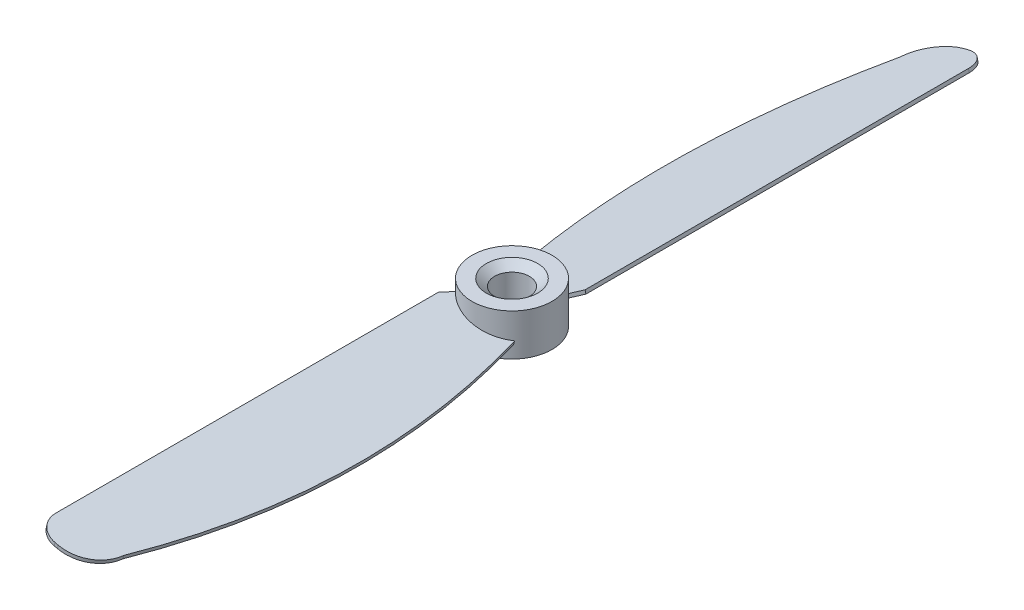
ISO-10303-21;
HEADER;
FILE_DESCRIPTION(('STEP AP214'),'2;1');
FILE_NAME('part.step','',(''),(''),'','','');
FILE_SCHEMA(('AUTOMOTIVE_DESIGN { 1 0 10303 214 1 1 1 1 }'));
ENDSEC;
DATA;
#1=APPLICATION_CONTEXT('core data for automotive mechanical design processes');
#2=APPLICATION_PROTOCOL_DEFINITION('international standard','automotive_design',2000,#1);
#3=PRODUCT_CONTEXT('',#1,'mechanical');
#4=PRODUCT('Part','Part','',(#3));
#5=PRODUCT_RELATED_PRODUCT_CATEGORY('part','',(#4));
#6=PRODUCT_DEFINITION_FORMATION('','',#4);
#7=PRODUCT_DEFINITION_CONTEXT('part definition',#1,'design');
#8=PRODUCT_DEFINITION('design','',#6,#7);
#9=PRODUCT_DEFINITION_SHAPE('','',#8);
#10=(LENGTH_UNIT() NAMED_UNIT(*) SI_UNIT(.MILLI.,.METRE.));
#11=(NAMED_UNIT(*) PLANE_ANGLE_UNIT() SI_UNIT($,.RADIAN.));
#12=(NAMED_UNIT(*) SI_UNIT($,.STERADIAN.) SOLID_ANGLE_UNIT());
#13=UNCERTAINTY_MEASURE_WITH_UNIT(LENGTH_MEASURE(1.E-05),#10,'distance_accuracy_value','');
#14=(GEOMETRIC_REPRESENTATION_CONTEXT(3) GLOBAL_UNCERTAINTY_ASSIGNED_CONTEXT((#13)) GLOBAL_UNIT_ASSIGNED_CONTEXT((#10,
#11,#12)) REPRESENTATION_CONTEXT('',''));
#15=CARTESIAN_POINT('',(0.,0.,0.));
#16=DIRECTION('',(0.,0.,1.));
#17=DIRECTION('',(1.,0.,0.));
#18=AXIS2_PLACEMENT_3D('',#15,#16,#17);
#19=CARTESIAN_POINT('',(0.,3.,0.));
#20=DIRECTION('',(0.,-1.,0.));
#21=DIRECTION('',(0.,0.,-1.));
#22=AXIS2_PLACEMENT_3D('',#19,#20,#21);
#23=CYLINDRICAL_SURFACE('',#22,5.75);
#24=CARTESIAN_POINT('',(-4.16559155928084,-1.21827861520743,-3.96362800490261));
#25=CARTESIAN_POINT('',(-4.18040945407615,-1.13611868313915,-3.9480572695151));
#26=CARTESIAN_POINT('',(-4.19518394090053,-1.05397651471106,-3.93235403166299));
#27=CARTESIAN_POINT('',(-4.22464609860738,-0.889727705135262,-3.90068255102959));
#28=CARTESIAN_POINT('',(-4.23933376948987,-0.807621063987559,-3.88471430824829));
#29=CARTESIAN_POINT('',(-4.25397803240141,-0.725532186480049,-3.86861356300241));
#30=B_SPLINE_CURVE_WITH_KNOTS('',3,(#24,#25,#26,#27,#28,#29),.UNSPECIFIED.,.F.,.F.,(4,2,4),(0.,
0.254774246670048,0.509548493340095),.UNSPECIFIED.);
#31=CARTESIAN_POINT('',(-4.16559155928084,-1.21827861520743,-3.96362800490261));
#32=VERTEX_POINT('',#31);
#33=CARTESIAN_POINT('',(-4.25397803240141,-0.725532186480051,-3.86861356300241));
#34=VERTEX_POINT('',#33);
#35=EDGE_CURVE('E55',#32,#34,#30,.T.);
#36=ORIENTED_EDGE('',*,*,#35,.F.);
#37=CARTESIAN_POINT('',(0.,-0.256576026948348,0.));
#38=DIRECTION('',(0.224951054343865,-0.974370064785235,0.));
#39=DIRECTION('',(-0.974370064785235,-0.224951054343865,0.));
#40=AXIS2_PLACEMENT_3D('',#37,#38,#39);
#41=ELLIPSE('',#40,5.901248619812,5.75);
#42=CARTESIAN_POINT('',(4.24871085634886,0.724316163072457,-3.87439750918041));
#43=VERTEX_POINT('',#42);
#44=EDGE_CURVE('E59',#32,#43,#41,.T.);
#45=ORIENTED_EDGE('',*,*,#44,.T.);
#46=CARTESIAN_POINT('',(0.,7.63382894883923,0.));
#47=DIRECTION('',(-0.810475447267826,-0.187113000462405,-0.555084024661109));
#48=DIRECTION('',(0.154377038802387,-0.982338396408262,0.105730813070979));
#49=AXIS2_PLACEMENT_3D('',#46,#47,#48);
#50=ELLIPSE('',#49,30.7300935038733,5.75);
#51=CARTESIAN_POINT('',(4.18258967618881,1.22220293971052,-3.94568670837394));
#52=VERTEX_POINT('',#51);
#53=EDGE_CURVE('E226',#52,#43,#50,.T.);
#54=ORIENTED_EDGE('',*,*,#53,.F.);
#55=CARTESIAN_POINT('',(0.,0.256576026948348,0.));
#56=DIRECTION('',(0.224951054343865,-0.974370064785235,0.));
#57=DIRECTION('',(-0.974370064785235,-0.224951054343865,0.));
#58=AXIS2_PLACEMENT_3D('',#55,#56,#57);
#59=ELLIPSE('',#58,5.901248619812,5.75);
#60=EDGE_CURVE('E457',#34,#52,#59,.T.);
#61=ORIENTED_EDGE('',*,*,#60,.F.);
#62=EDGE_LOOP('',(#36,#45,#54,#61));
#63=FACE_BOUND('',#62,.T.);
#64=CARTESIAN_POINT('',(4.16559155928084,-1.21827861520743,3.96362800490261));
#65=CARTESIAN_POINT('',(4.18040945407615,-1.13611868313915,3.9480572695151));
#66=CARTESIAN_POINT('',(4.19518394090053,-1.05397651471106,3.93235403166299));
#67=CARTESIAN_POINT('',(4.22464609860738,-0.889727705135262,3.90068255102959));
#68=CARTESIAN_POINT('',(4.23933376948987,-0.807621063987559,3.88471430824829));
#69=CARTESIAN_POINT('',(4.25397803240141,-0.725532186480049,3.86861356300241));
#70=B_SPLINE_CURVE_WITH_KNOTS('',3,(#64,#65,#66,#67,#68,#69),.UNSPECIFIED.,.F.,.F.,(4,2,4),(0.,
0.254774246670048,0.509548493340095),.UNSPECIFIED.);
#71=CARTESIAN_POINT('',(4.16559155928084,-1.21827861520743,3.96362800490261));
#72=VERTEX_POINT('',#71);
#73=CARTESIAN_POINT('',(4.25397803240141,-0.725532186480051,3.86861356300241));
#74=VERTEX_POINT('',#73);
#75=EDGE_CURVE('E199',#72,#74,#70,.T.);
#76=ORIENTED_EDGE('',*,*,#75,.F.);
#77=CARTESIAN_POINT('',(0.,-0.256576026948348,0.));
#78=DIRECTION('',(-0.224951054343865,-0.974370064785235,0.));
#79=DIRECTION('',(0.974370064785235,-0.224951054343865,0.));
#80=AXIS2_PLACEMENT_3D('',#77,#78,#79);
#81=ELLIPSE('',#80,5.901248619812,5.75);
#82=CARTESIAN_POINT('',(-4.24871085634886,0.724316163072457,3.87439750918041));
#83=VERTEX_POINT('',#82);
#84=EDGE_CURVE('E209',#72,#83,#81,.T.);
#85=ORIENTED_EDGE('',*,*,#84,.T.);
#86=CARTESIAN_POINT('',(0.,7.63382894883923,0.));
#87=DIRECTION('',(0.810475447267826,-0.187113000462405,0.555084024661109));
#88=DIRECTION('',(-0.154377038802387,-0.982338396408262,-0.105730813070979));
#89=AXIS2_PLACEMENT_3D('',#86,#87,#88);
#90=ELLIPSE('',#89,30.7300935038733,5.75);
#91=CARTESIAN_POINT('',(-4.18258967618881,1.22220293971052,3.94568670837394));
#92=VERTEX_POINT('',#91);
#93=EDGE_CURVE('E210',#92,#83,#90,.T.);
#94=ORIENTED_EDGE('',*,*,#93,.F.);
#95=CARTESIAN_POINT('',(0.,0.256576026948348,0.));
#96=DIRECTION('',(-0.224951054343865,-0.974370064785235,0.));
#97=DIRECTION('',(0.974370064785235,-0.224951054343865,0.));
#98=AXIS2_PLACEMENT_3D('',#95,#96,#97);
#99=ELLIPSE('',#98,5.901248619812,5.75);
#100=EDGE_CURVE('E358',#74,#92,#99,.T.);
#101=ORIENTED_EDGE('',*,*,#100,.F.);
#102=EDGE_LOOP('',(#76,#85,#94,#101));
#103=FACE_BOUND('',#102,.T.);
#104=CARTESIAN_POINT('',(0.,3.,0.));
#105=DIRECTION('',(0.,1.,0.));
#106=DIRECTION('',(0.,0.,1.));
#107=AXIS2_PLACEMENT_3D('',#104,#105,#106);
#108=CIRCLE('',#107,5.75);
#109=CARTESIAN_POINT('',(0.,3.,5.75));
#110=VERTEX_POINT('',#109);
#111=EDGE_CURVE('E352',#110,#110,#108,.T.);
#112=ORIENTED_EDGE('',*,*,#111,.F.);
#113=EDGE_LOOP('',(#112));
#114=FACE_BOUND('',#113,.T.);
#115=CARTESIAN_POINT('',(0.,-3.,0.));
#116=DIRECTION('',(0.,1.,0.));
#117=DIRECTION('',(0.,0.,1.));
#118=AXIS2_PLACEMENT_3D('',#115,#116,#117);
#119=CIRCLE('',#118,5.75);
#120=CARTESIAN_POINT('',(0.,-3.,5.75));
#121=VERTEX_POINT('',#120);
#122=EDGE_CURVE('E349',#121,#121,#119,.T.);
#123=ORIENTED_EDGE('',*,*,#122,.T.);
#124=EDGE_LOOP('',(#123));
#125=FACE_BOUND('',#124,.T.);
#126=ADVANCED_FACE('F39',(#63,#103,#114,#125),#23,.T.);
#127=CARTESIAN_POINT('',(0.,3.,0.));
#128=DIRECTION('',(0.,1.,0.));
#129=DIRECTION('',(0.,0.,1.));
#130=AXIS2_PLACEMENT_3D('',#127,#128,#129);
#131=PLANE('',#130);
#132=CARTESIAN_POINT('',(0.,3.,0.));
#133=DIRECTION('',(0.,1.,0.));
#134=DIRECTION('',(0.,0.,1.));
#135=AXIS2_PLACEMENT_3D('',#132,#133,#134);
#136=CIRCLE('',#135,3.69175359259419);
#137=CARTESIAN_POINT('',(0.,3.,3.69175359259419));
#138=VERTEX_POINT('',#137);
#139=EDGE_CURVE('E11',#138,#138,#136,.F.);
#140=ORIENTED_EDGE('',*,*,#139,.T.);
#141=EDGE_LOOP('',(#140));
#142=FACE_BOUND('',#141,.T.);
#143=ORIENTED_EDGE('',*,*,#111,.T.);
#144=EDGE_LOOP('',(#143));
#145=FACE_BOUND('',#144,.T.);
#146=ADVANCED_FACE('F196',(#142,#145),#131,.T.);
#147=CARTESIAN_POINT('',(0.,-3.,0.));
#148=DIRECTION('',(0.,1.,0.));
#149=DIRECTION('',(0.,0.,1.));
#150=AXIS2_PLACEMENT_3D('',#147,#148,#149);
#151=PLANE('',#150);
#152=CARTESIAN_POINT('',(0.,-3.,0.));
#153=DIRECTION('',(0.,1.,0.));
#154=DIRECTION('',(0.,0.,1.));
#155=AXIS2_PLACEMENT_3D('',#152,#153,#154);
#156=CIRCLE('',#155,3.5);
#157=CARTESIAN_POINT('',(0.,-3.,3.5));
#158=VERTEX_POINT('',#157);
#159=EDGE_CURVE('E48',#158,#158,#156,.T.);
#160=ORIENTED_EDGE('',*,*,#159,.T.);
#161=EDGE_LOOP('',(#160));
#162=FACE_BOUND('',#161,.T.);
#163=ORIENTED_EDGE('',*,*,#122,.F.);
#164=EDGE_LOOP('',(#163));
#165=FACE_BOUND('',#164,.T.);
#166=ADVANCED_FACE('F193',(#162,#165),#151,.F.);
#167=CARTESIAN_POINT('',(3.60809283915787,-1.08956989413782,1.848135525087));
#168=CARTESIAN_POINT('',(11.4569746547145,-2.90162704125372,30.4936742250074));
#169=CARTESIAN_POINT('',(3.01353523695643,-0.952305455997626,58.942904631039));
#170=B_SPLINE_CURVE_WITH_KNOTS('',2,(#167,#168,#169),.UNSPECIFIED.,.F.,.F.,(3,3),(0.,1.),.UNSPECIFIED.);
#171=DIRECTION('',(0.224951054343865,0.974370064785235,0.));
#172=VECTOR('',#171,1.);
#173=SURFACE_OF_LINEAR_EXTRUSION('',#170,#172);
#174=CARTESIAN_POINT('',(3.01353523695644,-0.952305455997627,58.942904631039));
#175=VERTEX_POINT('',#174);
#176=EDGE_CURVE('E174',#72,#175,#170,.T.);
#177=ORIENTED_EDGE('',*,*,#176,.F.);
#178=ORIENTED_EDGE('',*,*,#75,.T.);
#179=CARTESIAN_POINT('',(3.7205683663298,-0.602384861745206,1.848135525087));
#180=CARTESIAN_POINT('',(11.5694501818864,-2.4144420088611,30.4936742250074));
#181=CARTESIAN_POINT('',(3.12601076412837,-0.465120423605009,58.942904631039));
#182=B_SPLINE_CURVE_WITH_KNOTS('',2,(#179,#180,#181),.UNSPECIFIED.,.F.,.F.,(3,3),(0.,1.),.UNSPECIFIED.);
#183=CARTESIAN_POINT('',(3.12601076412837,-0.465120423605009,58.942904631039));
#184=VERTEX_POINT('',#183);
#185=EDGE_CURVE('E164',#74,#184,#182,.T.);
#186=ORIENTED_EDGE('',*,*,#185,.T.);
#187=DIRECTION('',(0.224951054343865,0.974370064785235,0.));
#188=VECTOR('',#187,1.);
#189=CARTESIAN_POINT('',(3.01353523695644,-0.952305455997627,58.942904631039));
#190=LINE('',#189,#188);
#191=EDGE_CURVE('E353',#175,#184,#190,.T.);
#192=ORIENTED_EDGE('',*,*,#191,.F.);
#193=EDGE_LOOP('',(#177,#178,#186,#192));
#194=FACE_BOUND('',#193,.T.);
#195=ADVANCED_FACE('F187',(#194),#173,.F.);
#196=CARTESIAN_POINT('',(-1.83916376203509,0.168028383976379,58.5));
#197=DIRECTION('',(0.224951054343865,0.974370064785235,0.));
#198=DIRECTION('',(-0.974370064785235,0.224951054343865,0.));
#199=AXIS2_PLACEMENT_3D('',#196,#197,#198);
#200=CYLINDRICAL_SURFACE('',#199,5.);
#201=CARTESIAN_POINT('',(-1.72668823486315,0.655213416368997,58.5));
#202=DIRECTION('',(-0.224951054343865,-0.974370064785235,0.));
#203=DIRECTION('',(0.974370064785235,-0.224951054343865,0.));
#204=AXIS2_PLACEMENT_3D('',#201,#202,#203);
#205=CIRCLE('',#204,5.);
#206=CARTESIAN_POINT('',(-1.72668823486314,0.655213416368994,63.5));
#207=VERTEX_POINT('',#206);
#208=EDGE_CURVE('E168',#184,#207,#205,.T.);
#209=ORIENTED_EDGE('',*,*,#208,.T.);
#210=DIRECTION('',(0.224951054343865,0.974370064785235,0.));
#211=VECTOR('',#210,1.);
#212=CARTESIAN_POINT('',(-1.83916376203508,0.168028383976377,63.5));
#213=LINE('',#212,#211);
#214=CARTESIAN_POINT('',(-1.83916376203508,0.168028383976377,63.5));
#215=VERTEX_POINT('',#214);
#216=EDGE_CURVE('E361',#215,#207,#213,.T.);
#217=ORIENTED_EDGE('',*,*,#216,.F.);
#218=CARTESIAN_POINT('',(-1.83916376203509,0.168028383976379,58.5));
#219=DIRECTION('',(-0.224951054343865,-0.974370064785235,0.));
#220=DIRECTION('',(0.974370064785235,-0.224951054343865,0.));
#221=AXIS2_PLACEMENT_3D('',#218,#219,#220);
#222=CIRCLE('',#221,5.);
#223=EDGE_CURVE('E180',#175,#215,#222,.T.);
#224=ORIENTED_EDGE('',*,*,#223,.F.);
#225=ORIENTED_EDGE('',*,*,#191,.T.);
#226=EDGE_LOOP('',(#209,#217,#224,#225));
#227=FACE_BOUND('',#226,.T.);
#228=ADVANCED_FACE('F192',(#227),#200,.T.);
#229=CARTESIAN_POINT('',(-2.31082061344451,0.276918948093252,63.5));
#230=DIRECTION('',(0.,0.,-1.));
#231=DIRECTION('',(-1.,0.,0.));
#232=AXIS2_PLACEMENT_3D('',#229,#230,#231);
#233=PLANE('',#232);
#234=DIRECTION('',(-0.974370064785235,0.224951054343865,0.));
#235=VECTOR('',#234,1.);
#236=CARTESIAN_POINT('',(-2.19834508627258,0.764103980485869,63.5));
#237=LINE('',#236,#235);
#238=CARTESIAN_POINT('',(-2.19834508627258,0.764103980485869,63.5));
#239=VERTEX_POINT('',#238);
#240=EDGE_CURVE('E402',#207,#239,#237,.T.);
#241=ORIENTED_EDGE('',*,*,#240,.T.);
#242=DIRECTION('',(0.224951054343865,0.974370064785235,0.));
#243=VECTOR('',#242,1.);
#244=CARTESIAN_POINT('',(-2.31082061344451,0.276918948093252,63.5));
#245=LINE('',#244,#243);
#246=CARTESIAN_POINT('',(-2.31082061344451,0.276918948093252,63.5));
#247=VERTEX_POINT('',#246);
#248=EDGE_CURVE('E416',#247,#239,#245,.T.);
#249=ORIENTED_EDGE('',*,*,#248,.F.);
#250=DIRECTION('',(-0.974370064785235,0.224951054343865,0.));
#251=VECTOR('',#250,1.);
#252=CARTESIAN_POINT('',(-2.31082061344451,0.276918948093252,63.5));
#253=LINE('',#252,#251);
#254=EDGE_CURVE('E428',#215,#247,#253,.T.);
#255=ORIENTED_EDGE('',*,*,#254,.F.);
#256=ORIENTED_EDGE('',*,*,#216,.T.);
#257=EDGE_LOOP('',(#241,#249,#255,#256));
#258=FACE_BOUND('',#257,.T.);
#259=ADVANCED_FACE('F426',(#258),#233,.F.);
#260=CARTESIAN_POINT('',(-2.31082061344453,0.276918948093257,60.5));
#261=DIRECTION('',(0.224951054343865,0.974370064785235,0.));
#262=DIRECTION('',(-0.974370064785235,0.224951054343865,0.));
#263=AXIS2_PLACEMENT_3D('',#260,#261,#262);
#264=CYLINDRICAL_SURFACE('',#263,3.);
#265=CARTESIAN_POINT('',(-2.1983450862726,0.764103980485874,60.5));
#266=DIRECTION('',(-0.224951054343865,-0.974370064785235,0.));
#267=DIRECTION('',(-0.974370064785235,0.224951054343865,0.));
#268=AXIS2_PLACEMENT_3D('',#265,#266,#267);
#269=CIRCLE('',#268,3.);
#270=CARTESIAN_POINT('',(-5.12145528062831,1.43895714351747,60.5));
#271=VERTEX_POINT('',#270);
#272=EDGE_CURVE('E405',#239,#271,#269,.T.);
#273=ORIENTED_EDGE('',*,*,#272,.T.);
#274=DIRECTION('',(0.224951054343865,0.974370064785235,0.));
#275=VECTOR('',#274,1.);
#276=CARTESIAN_POINT('',(-5.23393080780024,0.951772111124853,60.5));
#277=LINE('',#276,#275);
#278=CARTESIAN_POINT('',(-5.23393080780024,0.951772111124853,60.5));
#279=VERTEX_POINT('',#278);
#280=EDGE_CURVE('E389',#279,#271,#277,.T.);
#281=ORIENTED_EDGE('',*,*,#280,.F.);
#282=CARTESIAN_POINT('',(-2.31082061344453,0.276918948093257,60.5));
#283=DIRECTION('',(-0.224951054343865,-0.974370064785235,0.));
#284=DIRECTION('',(-0.974370064785235,0.224951054343865,0.));
#285=AXIS2_PLACEMENT_3D('',#282,#283,#284);
#286=CIRCLE('',#285,3.);
#287=EDGE_CURVE('E391',#247,#279,#286,.T.);
#288=ORIENTED_EDGE('',*,*,#287,.F.);
#289=ORIENTED_EDGE('',*,*,#248,.T.);
#290=EDGE_LOOP('',(#273,#281,#288,#289));
#291=FACE_BOUND('',#290,.T.);
#292=ADVANCED_FACE('F436',(#291),#264,.T.);
#293=CARTESIAN_POINT('',(-5.23393080780024,0.951772111124853,5.38958531563247));
#294=DIRECTION('',(0.974370064785235,-0.224951054343865,0.));
#295=DIRECTION('',(0.224951054343865,0.974370064785235,0.));
#296=AXIS2_PLACEMENT_3D('',#293,#294,#295);
#297=PLANE('',#296);
#298=DIRECTION('',(0.,0.,-1.));
#299=VECTOR('',#298,1.);
#300=CARTESIAN_POINT('',(-5.12145528062831,1.43895714351747,5.38958531563247));
#301=LINE('',#300,#299);
#302=CARTESIAN_POINT('',(-5.12145528062831,1.43895714351747,5.38958531563247));
#303=VERTEX_POINT('',#302);
#304=EDGE_CURVE('E408',#271,#303,#301,.T.);
#305=ORIENTED_EDGE('',*,*,#304,.T.);
#306=DIRECTION('',(0.224951054343865,0.974370064785235,0.));
#307=VECTOR('',#306,1.);
#308=CARTESIAN_POINT('',(-5.23393080780024,0.951772111124853,5.38958531563247));
#309=LINE('',#308,#307);
#310=CARTESIAN_POINT('',(-5.23393080780024,0.951772111124853,5.38958531563247));
#311=VERTEX_POINT('',#310);
#312=EDGE_CURVE('E385',#311,#303,#309,.T.);
#313=ORIENTED_EDGE('',*,*,#312,.F.);
#314=DIRECTION('',(0.,0.,-1.));
#315=VECTOR('',#314,1.);
#316=CARTESIAN_POINT('',(-5.23393080780024,0.951772111124853,5.38958531563247));
#317=LINE('',#316,#315);
#318=EDGE_CURVE('E382',#279,#311,#317,.T.);
#319=ORIENTED_EDGE('',*,*,#318,.F.);
#320=ORIENTED_EDGE('',*,*,#280,.T.);
#321=EDGE_LOOP('',(#305,#313,#319,#320));
#322=FACE_BOUND('',#321,.T.);
#323=ADVANCED_FACE('F439',(#322),#297,.F.);
#324=CARTESIAN_POINT('',(-3.87222938352537,0.63739856644941,3.29539975732111));
#325=DIRECTION('',(0.810475447267826,-0.187113000462405,0.555084024661109));
#326=DIRECTION('',(0.565063960332478,0.,-0.825047102130161));
#327=AXIS2_PLACEMENT_3D('',#324,#325,#326);
#328=PLANE('',#327);
#329=DIRECTION('',(0.540857257070294,-0.124866736596953,-0.831794280796656));
#330=VECTOR('',#329,1.);
#331=CARTESIAN_POINT('',(-3.75975385635343,1.12458359884203,3.29539975732111));
#332=LINE('',#331,#330);
#333=EDGE_CURVE('E181',#303,#92,#332,.T.);
#334=ORIENTED_EDGE('',*,*,#333,.T.);
#335=ORIENTED_EDGE('',*,*,#93,.T.);
#336=DIRECTION('',(0.540857257070294,-0.124866736596953,-0.831794280796656));
#337=VECTOR('',#336,1.);
#338=CARTESIAN_POINT('',(-3.87222938352537,0.63739856644941,3.29539975732111));
#339=LINE('',#338,#337);
#340=EDGE_CURVE('E376',#311,#83,#339,.T.);
#341=ORIENTED_EDGE('',*,*,#340,.F.);
#342=ORIENTED_EDGE('',*,*,#312,.T.);
#343=EDGE_LOOP('',(#334,#335,#341,#342));
#344=FACE_BOUND('',#343,.T.);
#345=ADVANCED_FACE('F374',(#344),#328,.F.);
#346=CARTESIAN_POINT('',(7.38389434638583,-1.96128235816072,30.4445971515352));
#347=DIRECTION('',(-0.224951054343865,-0.974370064785235,0.));
#348=DIRECTION('',(0.974370064785235,-0.224951054343865,0.));
#349=AXIS2_PLACEMENT_3D('',#346,#347,#348);
#350=PLANE('',#349);
#351=ORIENTED_EDGE('',*,*,#84,.F.);
#352=ORIENTED_EDGE('',*,*,#176,.T.);
#353=ORIENTED_EDGE('',*,*,#223,.T.);
#354=ORIENTED_EDGE('',*,*,#254,.T.);
#355=ORIENTED_EDGE('',*,*,#287,.T.);
#356=ORIENTED_EDGE('',*,*,#318,.T.);
#357=ORIENTED_EDGE('',*,*,#340,.T.);
#358=EDGE_LOOP('',(#351,#352,#353,#354,#355,#356,#357));
#359=FACE_BOUND('',#358,.T.);
#360=ADVANCED_FACE('F234',(#359),#350,.T.);
#361=CARTESIAN_POINT('',(7.49636987355777,-1.4740973257681,30.4445971515352));
#362=DIRECTION('',(-0.224951054343865,-0.974370064785235,0.));
#363=DIRECTION('',(0.974370064785235,-0.224951054343865,0.));
#364=AXIS2_PLACEMENT_3D('',#361,#362,#363);
#365=PLANE('',#364);
#366=ORIENTED_EDGE('',*,*,#185,.F.);
#367=ORIENTED_EDGE('',*,*,#100,.T.);
#368=ORIENTED_EDGE('',*,*,#333,.F.);
#369=ORIENTED_EDGE('',*,*,#304,.F.);
#370=ORIENTED_EDGE('',*,*,#272,.F.);
#371=ORIENTED_EDGE('',*,*,#240,.F.);
#372=ORIENTED_EDGE('',*,*,#208,.F.);
#373=EDGE_LOOP('',(#366,#367,#368,#369,#370,#371,#372));
#374=FACE_BOUND('',#373,.T.);
#375=ADVANCED_FACE('F232',(#374),#365,.F.);
#376=CARTESIAN_POINT('',(-3.60809283915787,-1.08956989413782,-1.848135525087));
#377=CARTESIAN_POINT('',(-11.4569746547145,-2.90162704125372,-30.4936742250074));
#378=CARTESIAN_POINT('',(-3.01353523695643,-0.952305455997626,-58.942904631039));
#379=B_SPLINE_CURVE_WITH_KNOTS('',2,(#376,#377,#378),.UNSPECIFIED.,.F.,.F.,(3,3),(0.,1.),.UNSPECIFIED.);
#380=DIRECTION('',(-0.224951054343865,0.974370064785235,0.));
#381=VECTOR('',#380,1.);
#382=SURFACE_OF_LINEAR_EXTRUSION('',#379,#381);
#383=CARTESIAN_POINT('',(-3.01353523695644,-0.952305455997627,-58.942904631039));
#384=VERTEX_POINT('',#383);
#385=EDGE_CURVE('E138',#32,#384,#379,.T.);
#386=ORIENTED_EDGE('',*,*,#385,.F.);
#387=ORIENTED_EDGE('',*,*,#35,.T.);
#388=CARTESIAN_POINT('',(-3.7205683663298,-0.602384861745206,-1.848135525087));
#389=CARTESIAN_POINT('',(-11.5694501818864,-2.4144420088611,-30.4936742250074));
#390=CARTESIAN_POINT('',(-3.12601076412837,-0.465120423605009,-58.942904631039));
#391=B_SPLINE_CURVE_WITH_KNOTS('',2,(#388,#389,#390),.UNSPECIFIED.,.F.,.F.,(3,3),(0.,1.),.UNSPECIFIED.);
#392=CARTESIAN_POINT('',(-3.12601076412837,-0.465120423605009,-58.942904631039));
#393=VERTEX_POINT('',#392);
#394=EDGE_CURVE('E161',#34,#393,#391,.T.);
#395=ORIENTED_EDGE('',*,*,#394,.T.);
#396=DIRECTION('',(-0.224951054343865,0.974370064785235,0.));
#397=VECTOR('',#396,1.);
#398=CARTESIAN_POINT('',(-3.01353523695644,-0.952305455997627,-58.942904631039));
#399=LINE('',#398,#397);
#400=EDGE_CURVE('E152',#384,#393,#399,.T.);
#401=ORIENTED_EDGE('',*,*,#400,.F.);
#402=EDGE_LOOP('',(#386,#387,#395,#401));
#403=FACE_BOUND('',#402,.T.);
#404=ADVANCED_FACE('F159',(#403),#382,.F.);
#405=CARTESIAN_POINT('',(1.83916376203509,0.168028383976379,-58.5));
#406=DIRECTION('',(-0.224951054343865,0.974370064785235,0.));
#407=DIRECTION('',(-0.974370064785235,-0.224951054343865,0.));
#408=AXIS2_PLACEMENT_3D('',#405,#406,#407);
#409=CYLINDRICAL_SURFACE('',#408,5.);
#410=CARTESIAN_POINT('',(1.72668823486315,0.655213416368997,-58.5));
#411=DIRECTION('',(0.224951054343865,-0.974370064785235,0.));
#412=DIRECTION('',(-0.974370064785235,-0.224951054343865,0.));
#413=AXIS2_PLACEMENT_3D('',#410,#411,#412);
#414=CIRCLE('',#413,5.);
#415=CARTESIAN_POINT('',(1.72668823486314,0.655213416368994,-63.5));
#416=VERTEX_POINT('',#415);
#417=EDGE_CURVE('E259',#393,#416,#414,.T.);
#418=ORIENTED_EDGE('',*,*,#417,.T.);
#419=DIRECTION('',(-0.224951054343865,0.974370064785235,0.));
#420=VECTOR('',#419,1.);
#421=CARTESIAN_POINT('',(1.83916376203508,0.168028383976377,-63.5));
#422=LINE('',#421,#420);
#423=CARTESIAN_POINT('',(1.83916376203508,0.168028383976377,-63.5));
#424=VERTEX_POINT('',#423);
#425=EDGE_CURVE('E154',#424,#416,#422,.T.);
#426=ORIENTED_EDGE('',*,*,#425,.F.);
#427=CARTESIAN_POINT('',(1.83916376203509,0.168028383976379,-58.5));
#428=DIRECTION('',(0.224951054343865,-0.974370064785235,0.));
#429=DIRECTION('',(-0.974370064785235,-0.224951054343865,0.));
#430=AXIS2_PLACEMENT_3D('',#427,#428,#429);
#431=CIRCLE('',#430,5.);
#432=EDGE_CURVE('E141',#384,#424,#431,.T.);
#433=ORIENTED_EDGE('',*,*,#432,.F.);
#434=ORIENTED_EDGE('',*,*,#400,.T.);
#435=EDGE_LOOP('',(#418,#426,#433,#434));
#436=FACE_BOUND('',#435,.T.);
#437=ADVANCED_FACE('F151',(#436),#409,.T.);
#438=CARTESIAN_POINT('',(2.31082061344451,0.276918948093252,-63.5));
#439=DIRECTION('',(0.,0.,1.));
#440=DIRECTION('',(1.,0.,0.));
#441=AXIS2_PLACEMENT_3D('',#438,#439,#440);
#442=PLANE('',#441);
#443=DIRECTION('',(0.974370064785235,0.224951054343865,0.));
#444=VECTOR('',#443,1.);
#445=CARTESIAN_POINT('',(2.19834508627258,0.764103980485869,-63.5));
#446=LINE('',#445,#444);
#447=CARTESIAN_POINT('',(2.19834508627258,0.764103980485869,-63.5));
#448=VERTEX_POINT('',#447);
#449=EDGE_CURVE('E265',#416,#448,#446,.T.);
#450=ORIENTED_EDGE('',*,*,#449,.T.);
#451=DIRECTION('',(-0.224951054343865,0.974370064785235,0.));
#452=VECTOR('',#451,1.);
#453=CARTESIAN_POINT('',(2.31082061344451,0.276918948093252,-63.5));
#454=LINE('',#453,#452);
#455=CARTESIAN_POINT('',(2.31082061344451,0.276918948093252,-63.5));
#456=VERTEX_POINT('',#455);
#457=EDGE_CURVE('E170',#456,#448,#454,.T.);
#458=ORIENTED_EDGE('',*,*,#457,.F.);
#459=DIRECTION('',(0.974370064785235,0.224951054343865,0.));
#460=VECTOR('',#459,1.);
#461=CARTESIAN_POINT('',(2.31082061344451,0.276918948093252,-63.5));
#462=LINE('',#461,#460);
#463=EDGE_CURVE('E157',#424,#456,#462,.T.);
#464=ORIENTED_EDGE('',*,*,#463,.F.);
#465=ORIENTED_EDGE('',*,*,#425,.T.);
#466=EDGE_LOOP('',(#450,#458,#464,#465));
#467=FACE_BOUND('',#466,.T.);
#468=ADVANCED_FACE('F305',(#467),#442,.F.);
#469=CARTESIAN_POINT('',(2.31082061344453,0.276918948093257,-60.5));
#470=DIRECTION('',(-0.224951054343865,0.974370064785235,0.));
#471=DIRECTION('',(-0.974370064785235,-0.224951054343865,0.));
#472=AXIS2_PLACEMENT_3D('',#469,#470,#471);
#473=CYLINDRICAL_SURFACE('',#472,3.);
#474=CARTESIAN_POINT('',(2.1983450862726,0.764103980485874,-60.5));
#475=DIRECTION('',(0.224951054343865,-0.974370064785235,0.));
#476=DIRECTION('',(0.974370064785235,0.224951054343865,0.));
#477=AXIS2_PLACEMENT_3D('',#474,#475,#476);
#478=CIRCLE('',#477,3.);
#479=CARTESIAN_POINT('',(5.12145528062831,1.43895714351747,-60.5));
#480=VERTEX_POINT('',#479);
#481=EDGE_CURVE('E268',#448,#480,#478,.T.);
#482=ORIENTED_EDGE('',*,*,#481,.T.);
#483=DIRECTION('',(-0.224951054343865,0.974370064785235,0.));
#484=VECTOR('',#483,1.);
#485=CARTESIAN_POINT('',(5.23393080780024,0.951772111124853,-60.5));
#486=LINE('',#485,#484);
#487=CARTESIAN_POINT('',(5.23393080780024,0.951772111124853,-60.5));
#488=VERTEX_POINT('',#487);
#489=EDGE_CURVE('E280',#488,#480,#486,.T.);
#490=ORIENTED_EDGE('',*,*,#489,.F.);
#491=CARTESIAN_POINT('',(2.31082061344453,0.276918948093257,-60.5));
#492=DIRECTION('',(0.224951054343865,-0.974370064785235,0.));
#493=DIRECTION('',(0.974370064785235,0.224951054343865,0.));
#494=AXIS2_PLACEMENT_3D('',#491,#492,#493);
#495=CIRCLE('',#494,3.);
#496=EDGE_CURVE('E245',#456,#488,#495,.T.);
#497=ORIENTED_EDGE('',*,*,#496,.F.);
#498=ORIENTED_EDGE('',*,*,#457,.T.);
#499=EDGE_LOOP('',(#482,#490,#497,#498));
#500=FACE_BOUND('',#499,.T.);
#501=ADVANCED_FACE('F289',(#500),#473,.T.);
#502=CARTESIAN_POINT('',(5.23393080780024,0.951772111124853,-5.38958531563247));
#503=DIRECTION('',(-0.974370064785235,-0.224951054343865,0.));
#504=DIRECTION('',(0.224951054343865,-0.974370064785235,0.));
#505=AXIS2_PLACEMENT_3D('',#502,#503,#504);
#506=PLANE('',#505);
#507=DIRECTION('',(0.,0.,1.));
#508=VECTOR('',#507,1.);
#509=CARTESIAN_POINT('',(5.12145528062831,1.43895714351747,-5.38958531563247));
#510=LINE('',#509,#508);
#511=CARTESIAN_POINT('',(5.12145528062831,1.43895714351747,-5.38958531563247));
#512=VERTEX_POINT('',#511);
#513=EDGE_CURVE('E271',#480,#512,#510,.T.);
#514=ORIENTED_EDGE('',*,*,#513,.T.);
#515=DIRECTION('',(-0.224951054343865,0.974370064785235,0.));
#516=VECTOR('',#515,1.);
#517=CARTESIAN_POINT('',(5.23393080780024,0.951772111124853,-5.38958531563247));
#518=LINE('',#517,#516);
#519=CARTESIAN_POINT('',(5.23393080780024,0.951772111124853,-5.38958531563247));
#520=VERTEX_POINT('',#519);
#521=EDGE_CURVE('E254',#520,#512,#518,.T.);
#522=ORIENTED_EDGE('',*,*,#521,.F.);
#523=DIRECTION('',(0.,0.,1.));
#524=VECTOR('',#523,1.);
#525=CARTESIAN_POINT('',(5.23393080780024,0.951772111124853,-5.38958531563247));
#526=LINE('',#525,#524);
#527=EDGE_CURVE('E248',#488,#520,#526,.T.);
#528=ORIENTED_EDGE('',*,*,#527,.F.);
#529=ORIENTED_EDGE('',*,*,#489,.T.);
#530=EDGE_LOOP('',(#514,#522,#528,#529));
#531=FACE_BOUND('',#530,.T.);
#532=ADVANCED_FACE('F300',(#531),#506,.F.);
#533=CARTESIAN_POINT('',(3.87222938352537,0.63739856644941,-3.29539975732111));
#534=DIRECTION('',(-0.810475447267826,-0.187113000462405,-0.555084024661109));
#535=DIRECTION('',(-0.565063960332478,0.,0.825047102130161));
#536=AXIS2_PLACEMENT_3D('',#533,#534,#535);
#537=PLANE('',#536);
#538=DIRECTION('',(-0.540857257070294,-0.124866736596953,0.831794280796656));
#539=VECTOR('',#538,1.);
#540=CARTESIAN_POINT('',(3.75975385635343,1.12458359884203,-3.29539975732111));
#541=LINE('',#540,#539);
#542=EDGE_CURVE('E147',#512,#52,#541,.T.);
#543=ORIENTED_EDGE('',*,*,#542,.T.);
#544=ORIENTED_EDGE('',*,*,#53,.T.);
#545=DIRECTION('',(-0.540857257070294,-0.124866736596953,0.831794280796656));
#546=VECTOR('',#545,1.);
#547=CARTESIAN_POINT('',(3.87222938352537,0.63739856644941,-3.29539975732111));
#548=LINE('',#547,#546);
#549=EDGE_CURVE('E251',#520,#43,#548,.T.);
#550=ORIENTED_EDGE('',*,*,#549,.F.);
#551=ORIENTED_EDGE('',*,*,#521,.T.);
#552=EDGE_LOOP('',(#543,#544,#550,#551));
#553=FACE_BOUND('',#552,.T.);
#554=ADVANCED_FACE('F304',(#553),#537,.F.);
#555=CARTESIAN_POINT('',(-7.38389434638583,-1.96128235816072,-30.4445971515352));
#556=DIRECTION('',(0.224951054343865,-0.974370064785235,0.));
#557=DIRECTION('',(-0.974370064785235,-0.224951054343865,0.));
#558=AXIS2_PLACEMENT_3D('',#555,#556,#557);
#559=PLANE('',#558);
#560=ORIENTED_EDGE('',*,*,#44,.F.);
#561=ORIENTED_EDGE('',*,*,#385,.T.);
#562=ORIENTED_EDGE('',*,*,#432,.T.);
#563=ORIENTED_EDGE('',*,*,#463,.T.);
#564=ORIENTED_EDGE('',*,*,#496,.T.);
#565=ORIENTED_EDGE('',*,*,#527,.T.);
#566=ORIENTED_EDGE('',*,*,#549,.T.);
#567=EDGE_LOOP('',(#560,#561,#562,#563,#564,#565,#566));
#568=FACE_BOUND('',#567,.T.);
#569=ADVANCED_FACE('F140',(#568),#559,.T.);
#570=CARTESIAN_POINT('',(-7.49636987355777,-1.4740973257681,-30.4445971515352));
#571=DIRECTION('',(0.224951054343865,-0.974370064785235,0.));
#572=DIRECTION('',(-0.974370064785235,-0.224951054343865,0.));
#573=AXIS2_PLACEMENT_3D('',#570,#571,#572);
#574=PLANE('',#573);
#575=ORIENTED_EDGE('',*,*,#394,.F.);
#576=ORIENTED_EDGE('',*,*,#60,.T.);
#577=ORIENTED_EDGE('',*,*,#542,.F.);
#578=ORIENTED_EDGE('',*,*,#513,.F.);
#579=ORIENTED_EDGE('',*,*,#481,.F.);
#580=ORIENTED_EDGE('',*,*,#449,.F.);
#581=ORIENTED_EDGE('',*,*,#417,.F.);
#582=EDGE_LOOP('',(#575,#576,#577,#578,#579,#580,#581));
#583=FACE_BOUND('',#582,.T.);
#584=ADVANCED_FACE('F295',(#583),#574,.F.);
#585=CARTESIAN_POINT('',(0.,3.,0.));
#586=DIRECTION('',(0.,-1.,0.));
#587=DIRECTION('',(0.,0.,-1.));
#588=AXIS2_PLACEMENT_3D('',#585,#586,#587);
#589=CYLINDRICAL_SURFACE('',#588,2.5);
#590=CARTESIAN_POINT('',(0.,-1.80824640740581,0.));
#591=DIRECTION('',(0.,1.,0.));
#592=DIRECTION('',(0.,0.,1.));
#593=AXIS2_PLACEMENT_3D('',#590,#591,#592);
#594=CIRCLE('',#593,2.5);
#595=CARTESIAN_POINT('',(0.,-1.80824640740581,2.5));
#596=VERTEX_POINT('',#595);
#597=EDGE_CURVE('E331',#596,#596,#594,.F.);
#598=ORIENTED_EDGE('',*,*,#597,.T.);
#599=EDGE_LOOP('',(#598));
#600=FACE_BOUND('',#599,.T.);
#601=CARTESIAN_POINT('',(0.,2.,0.));
#602=DIRECTION('',(0.,1.,0.));
#603=DIRECTION('',(0.,0.,1.));
#604=AXIS2_PLACEMENT_3D('',#601,#602,#603);
#605=CIRCLE('',#604,2.5);
#606=CARTESIAN_POINT('',(0.,2.,2.5));
#607=VERTEX_POINT('',#606);
#608=EDGE_CURVE('E334',#607,#607,#605,.T.);
#609=ORIENTED_EDGE('',*,*,#608,.T.);
#610=EDGE_LOOP('',(#609));
#611=FACE_BOUND('',#610,.T.);
#612=ADVANCED_FACE('F319',(#600,#611),#589,.F.);
#613=CARTESIAN_POINT('',(0.,-1.80824640740581,0.));
#614=DIRECTION('',(0.,-1.,0.));
#615=DIRECTION('',(0.,0.,-1.));
#616=AXIS2_PLACEMENT_3D('',#613,#614,#615);
#617=CONICAL_SURFACE('',#616,2.5,0.698131700797741);
#618=ORIENTED_EDGE('',*,*,#159,.F.);
#619=EDGE_LOOP('',(#618));
#620=FACE_BOUND('',#619,.T.);
#621=ORIENTED_EDGE('',*,*,#597,.F.);
#622=EDGE_LOOP('',(#621));
#623=FACE_BOUND('',#622,.T.);
#624=ADVANCED_FACE('F215',(#620,#623),#617,.F.);
#625=CARTESIAN_POINT('',(0.,3.,0.));
#626=DIRECTION('',(0.,1.,0.));
#627=DIRECTION('',(0.,0.,1.));
#628=AXIS2_PLACEMENT_3D('',#625,#626,#627);
#629=CONICAL_SURFACE('',#628,3.69175359259419,0.872664625997157);
#630=ORIENTED_EDGE('',*,*,#608,.F.);
#631=EDGE_LOOP('',(#630));
#632=FACE_BOUND('',#631,.T.);
#633=ORIENTED_EDGE('',*,*,#139,.F.);
#634=EDGE_LOOP('',(#633));
#635=FACE_BOUND('',#634,.T.);
#636=ADVANCED_FACE('F41',(#632,#635),#629,.F.);
#637=CLOSED_SHELL('',(#126,#146,#166,#195,#228,#259,#292,#323,#345,#360,#375,#404,#437,#468,
#501,#532,#554,#569,#584,#612,#624,#636));
#638=MANIFOLD_SOLID_BREP('B2',#637);
#639=ADVANCED_BREP_SHAPE_REPRESENTATION('',(#18,#638),#14);
#640=SHAPE_DEFINITION_REPRESENTATION(#9,#639);
ENDSEC;
END-ISO-10303-21;
